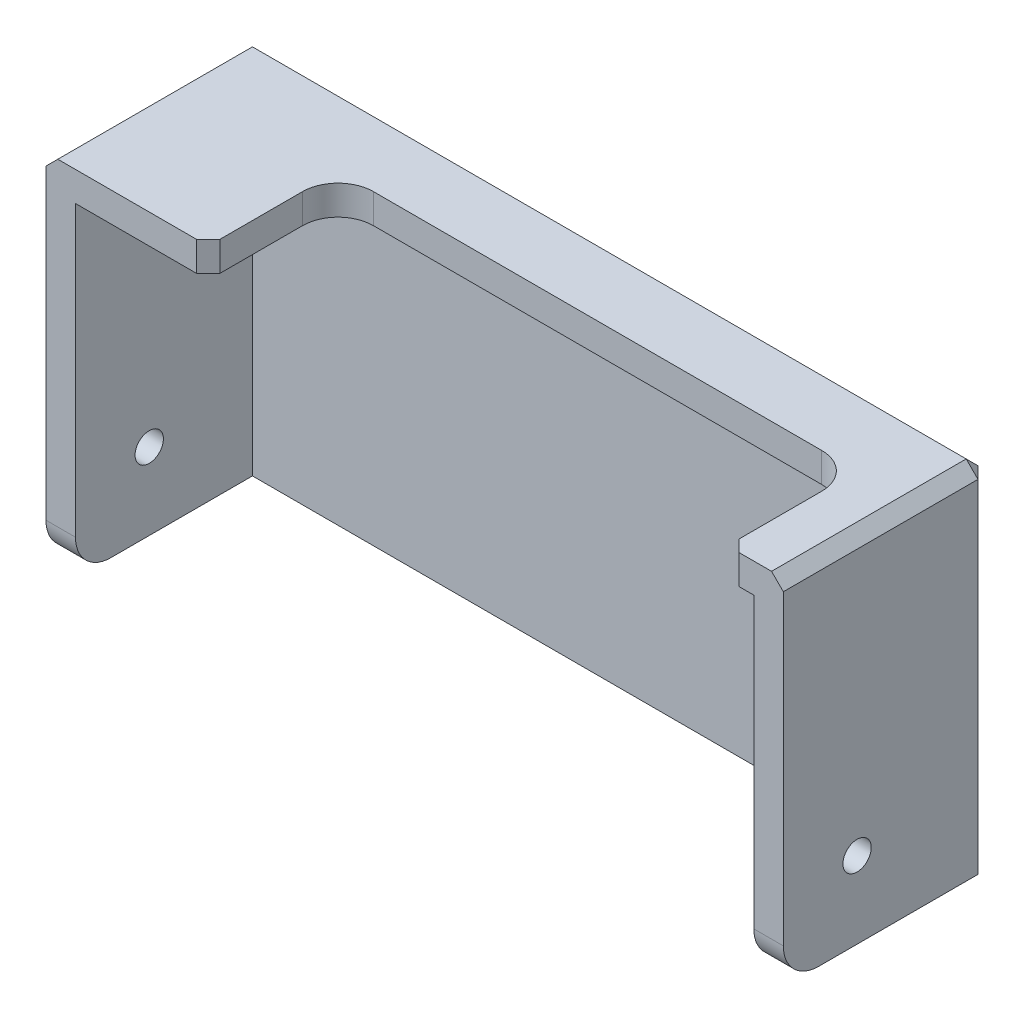
ISO-10303-21;
HEADER;
FILE_DESCRIPTION(('STEP AP214'),'2;1');
FILE_NAME('part.step','',(''),(''),'','','');
FILE_SCHEMA(('AUTOMOTIVE_DESIGN { 1 0 10303 214 1 1 1 1 }'));
ENDSEC;
DATA;
#1=APPLICATION_CONTEXT('core data for automotive mechanical design processes');
#2=APPLICATION_PROTOCOL_DEFINITION('international standard','automotive_design',2000,#1);
#3=PRODUCT_CONTEXT('',#1,'mechanical');
#4=PRODUCT('Part','Part','',(#3));
#5=PRODUCT_RELATED_PRODUCT_CATEGORY('part','',(#4));
#6=PRODUCT_DEFINITION_FORMATION('','',#4);
#7=PRODUCT_DEFINITION_CONTEXT('part definition',#1,'design');
#8=PRODUCT_DEFINITION('design','',#6,#7);
#9=PRODUCT_DEFINITION_SHAPE('','',#8);
#10=(LENGTH_UNIT() NAMED_UNIT(*) SI_UNIT(.MILLI.,.METRE.));
#11=(NAMED_UNIT(*) PLANE_ANGLE_UNIT() SI_UNIT($,.RADIAN.));
#12=(NAMED_UNIT(*) SI_UNIT($,.STERADIAN.) SOLID_ANGLE_UNIT());
#13=UNCERTAINTY_MEASURE_WITH_UNIT(LENGTH_MEASURE(1.E-05),#10,'distance_accuracy_value','');
#14=(GEOMETRIC_REPRESENTATION_CONTEXT(3) GLOBAL_UNCERTAINTY_ASSIGNED_CONTEXT((#13)) GLOBAL_UNIT_ASSIGNED_CONTEXT((#10,
#11,#12)) REPRESENTATION_CONTEXT('',''));
#15=CARTESIAN_POINT('',(0.,0.,0.));
#16=DIRECTION('',(0.,0.,1.));
#17=DIRECTION('',(1.,0.,0.));
#18=AXIS2_PLACEMENT_3D('',#15,#16,#17);
#19=CARTESIAN_POINT('',(0.,0.,30.));
#20=DIRECTION('',(0.,0.,-1.));
#21=DIRECTION('',(-1.,0.,0.));
#22=AXIS2_PLACEMENT_3D('',#19,#20,#21);
#23=PLANE('',#22);
#24=DIRECTION('',(0.,-1.,0.));
#25=VECTOR('',#24,1.);
#26=CARTESIAN_POINT('',(-62.5,0.,30.));
#27=LINE('',#26,#25);
#28=CARTESIAN_POINT('',(-62.5,30.5,30.));
#29=VERTEX_POINT('',#28);
#30=CARTESIAN_POINT('',(-62.5,-21.5,30.));
#31=VERTEX_POINT('',#30);
#32=EDGE_CURVE('E246',#29,#31,#27,.T.);
#33=ORIENTED_EDGE('',*,*,#32,.T.);
#34=DIRECTION('',(1.,0.,0.));
#35=VECTOR('',#34,1.);
#36=CARTESIAN_POINT('',(0.,-21.5,30.));
#37=LINE('',#36,#35);
#38=CARTESIAN_POINT('',(-57.5,-21.5,30.));
#39=VERTEX_POINT('',#38);
#40=EDGE_CURVE('E367',#31,#39,#37,.T.);
#41=ORIENTED_EDGE('',*,*,#40,.T.);
#42=DIRECTION('',(0.,-1.,0.));
#43=VECTOR('',#42,1.);
#44=CARTESIAN_POINT('',(-57.5,-27.5,30.));
#45=LINE('',#44,#43);
#46=CARTESIAN_POINT('',(-57.5,27.5,30.));
#47=VERTEX_POINT('',#46);
#48=EDGE_CURVE('E220',#47,#39,#45,.T.);
#49=ORIENTED_EDGE('',*,*,#48,.F.);
#50=DIRECTION('',(-1.,0.,0.));
#51=VECTOR('',#50,1.);
#52=CARTESIAN_POINT('',(-57.5,27.5,30.));
#53=LINE('',#52,#51);
#54=CARTESIAN_POINT('',(-37.,27.5,30.));
#55=VERTEX_POINT('',#54);
#56=EDGE_CURVE('E203',#55,#47,#53,.T.);
#57=ORIENTED_EDGE('',*,*,#56,.F.);
#58=DIRECTION('',(0.,1.,0.));
#59=VECTOR('',#58,1.);
#60=CARTESIAN_POINT('',(-37.,0.,30.));
#61=LINE('',#60,#59);
#62=CARTESIAN_POINT('',(-37.,32.5,30.));
#63=VERTEX_POINT('',#62);
#64=EDGE_CURVE('E289',#55,#63,#61,.T.);
#65=ORIENTED_EDGE('',*,*,#64,.T.);
#66=DIRECTION('',(-1.,0.,0.));
#67=VECTOR('',#66,1.);
#68=CARTESIAN_POINT('',(0.,32.5,30.));
#69=LINE('',#68,#67);
#70=CARTESIAN_POINT('',(-60.5,32.5,30.));
#71=VERTEX_POINT('',#70);
#72=EDGE_CURVE('E242',#63,#71,#69,.T.);
#73=ORIENTED_EDGE('',*,*,#72,.T.);
#74=DIRECTION('',(0.70710678118655,0.707106781186545,0.));
#75=VECTOR('',#74,1.);
#76=CARTESIAN_POINT('',(-62.5,30.5,30.));
#77=LINE('',#76,#75);
#78=EDGE_CURVE('E287',#71,#29,#77,.F.);
#79=ORIENTED_EDGE('',*,*,#78,.T.);
#80=EDGE_LOOP('',(#33,#41,#49,#57,#65,#73,#79));
#81=FACE_BOUND('',#80,.T.);
#82=ADVANCED_FACE('F41',(#81),#23,.F.);
#83=CARTESIAN_POINT('',(-57.5,-27.5,30.));
#84=DIRECTION('',(0.,1.,0.));
#85=DIRECTION('',(0.,0.,1.));
#86=AXIS2_PLACEMENT_3D('',#83,#84,#85);
#87=PLANE('',#86);
#88=DIRECTION('',(0.,0.,-1.));
#89=VECTOR('',#88,1.);
#90=CARTESIAN_POINT('',(62.5,-27.5,30.));
#91=LINE('',#90,#89);
#92=CARTESIAN_POINT('',(62.5,-27.5,24.));
#93=VERTEX_POINT('',#92);
#94=CARTESIAN_POINT('',(62.5,-27.5,-3.00000000000001));
#95=VERTEX_POINT('',#94);
#96=EDGE_CURVE('E256',#93,#95,#91,.T.);
#97=ORIENTED_EDGE('',*,*,#96,.F.);
#98=DIRECTION('',(1.,0.,0.));
#99=VECTOR('',#98,1.);
#100=CARTESIAN_POINT('',(-57.5,-27.5,24.));
#101=LINE('',#100,#99);
#102=CARTESIAN_POINT('',(57.5,-27.5,24.));
#103=VERTEX_POINT('',#102);
#104=EDGE_CURVE('E364',#93,#103,#101,.F.);
#105=ORIENTED_EDGE('',*,*,#104,.T.);
#106=DIRECTION('',(0.,0.,-1.));
#107=VECTOR('',#106,1.);
#108=CARTESIAN_POINT('',(57.5,-27.5,30.));
#109=LINE('',#108,#107);
#110=CARTESIAN_POINT('',(57.5,-27.5,0.));
#111=VERTEX_POINT('',#110);
#112=EDGE_CURVE('E223',#103,#111,#109,.T.);
#113=ORIENTED_EDGE('',*,*,#112,.T.);
#114=DIRECTION('',(1.,0.,0.));
#115=VECTOR('',#114,1.);
#116=CARTESIAN_POINT('',(-57.5,-27.5,0.));
#117=LINE('',#116,#115);
#118=CARTESIAN_POINT('',(-57.5,-27.5,0.));
#119=VERTEX_POINT('',#118);
#120=EDGE_CURVE('E204',#119,#111,#117,.T.);
#121=ORIENTED_EDGE('',*,*,#120,.F.);
#122=DIRECTION('',(0.,0.,-1.));
#123=VECTOR('',#122,1.);
#124=CARTESIAN_POINT('',(-57.5,-27.5,30.));
#125=LINE('',#124,#123);
#126=CARTESIAN_POINT('',(-57.5,-27.5,24.));
#127=VERTEX_POINT('',#126);
#128=EDGE_CURVE('E237',#127,#119,#125,.T.);
#129=ORIENTED_EDGE('',*,*,#128,.F.);
#130=DIRECTION('',(1.,0.,0.));
#131=VECTOR('',#130,1.);
#132=CARTESIAN_POINT('',(-57.5,-27.5,24.));
#133=LINE('',#132,#131);
#134=CARTESIAN_POINT('',(-62.5,-27.5,24.));
#135=VERTEX_POINT('',#134);
#136=EDGE_CURVE('E362',#127,#135,#133,.F.);
#137=ORIENTED_EDGE('',*,*,#136,.T.);
#138=DIRECTION('',(0.,0.,-1.));
#139=VECTOR('',#138,1.);
#140=CARTESIAN_POINT('',(-62.5,-27.5,30.));
#141=LINE('',#140,#139);
#142=CARTESIAN_POINT('',(-62.5,-27.5,-3.00000000000001));
#143=VERTEX_POINT('',#142);
#144=EDGE_CURVE('E257',#135,#143,#141,.T.);
#145=ORIENTED_EDGE('',*,*,#144,.T.);
#146=DIRECTION('',(1.,0.,0.));
#147=VECTOR('',#146,1.);
#148=CARTESIAN_POINT('',(62.5,-27.5,-3.00000000000001));
#149=LINE('',#148,#147);
#150=EDGE_CURVE('E309',#143,#95,#149,.T.);
#151=ORIENTED_EDGE('',*,*,#150,.T.);
#152=EDGE_LOOP('',(#97,#105,#113,#121,#129,#137,#145,#151));
#153=FACE_BOUND('',#152,.T.);
#154=ADVANCED_FACE('F377',(#153),#87,.F.);
#155=DIRECTION('',(0.,1.,0.));
#156=VECTOR('',#155,1.);
#157=CARTESIAN_POINT('',(57.5,-27.5,30.));
#158=LINE('',#157,#156);
#159=CARTESIAN_POINT('',(57.5,-21.5,30.));
#160=VERTEX_POINT('',#159);
#161=CARTESIAN_POINT('',(57.5,27.5,30.));
#162=VERTEX_POINT('',#161);
#163=EDGE_CURVE('E190',#160,#162,#158,.T.);
#164=ORIENTED_EDGE('',*,*,#163,.F.);
#165=DIRECTION('',(1.,0.,0.));
#166=VECTOR('',#165,1.);
#167=CARTESIAN_POINT('',(0.,-21.5,30.));
#168=LINE('',#167,#166);
#169=CARTESIAN_POINT('',(62.5,-21.5,30.));
#170=VERTEX_POINT('',#169);
#171=EDGE_CURVE('E358',#160,#170,#168,.T.);
#172=ORIENTED_EDGE('',*,*,#171,.T.);
#173=DIRECTION('',(0.,1.,0.));
#174=VECTOR('',#173,1.);
#175=CARTESIAN_POINT('',(62.5,0.,30.));
#176=LINE('',#175,#174);
#177=CARTESIAN_POINT('',(62.5,30.5,30.));
#178=VERTEX_POINT('',#177);
#179=EDGE_CURVE('E240',#170,#178,#176,.T.);
#180=ORIENTED_EDGE('',*,*,#179,.T.);
#181=DIRECTION('',(0.707106781186551,-0.707106781186544,0.));
#182=VECTOR('',#181,1.);
#183=CARTESIAN_POINT('',(60.5,32.5,30.));
#184=LINE('',#183,#182);
#185=CARTESIAN_POINT('',(60.5,32.5,30.));
#186=VERTEX_POINT('',#185);
#187=EDGE_CURVE('E280',#178,#186,#184,.F.);
#188=ORIENTED_EDGE('',*,*,#187,.T.);
#189=DIRECTION('',(-1.,0.,0.));
#190=VECTOR('',#189,1.);
#191=CARTESIAN_POINT('',(0.,32.5,30.));
#192=LINE('',#191,#190);
#193=CARTESIAN_POINT('',(55.,32.5,30.));
#194=VERTEX_POINT('',#193);
#195=EDGE_CURVE('E244',#186,#194,#192,.T.);
#196=ORIENTED_EDGE('',*,*,#195,.T.);
#197=DIRECTION('',(0.,-1.,0.));
#198=VECTOR('',#197,1.);
#199=CARTESIAN_POINT('',(55.,0.,30.));
#200=LINE('',#199,#198);
#201=CARTESIAN_POINT('',(55.,27.5,30.));
#202=VERTEX_POINT('',#201);
#203=EDGE_CURVE('E219',#194,#202,#200,.T.);
#204=ORIENTED_EDGE('',*,*,#203,.T.);
#205=EDGE_CURVE('E209',#162,#202,#53,.T.);
#206=ORIENTED_EDGE('',*,*,#205,.F.);
#207=EDGE_LOOP('',(#164,#172,#180,#188,#196,#204,#206));
#208=FACE_BOUND('',#207,.T.);
#209=ADVANCED_FACE('F216',(#208),#23,.F.);
#210=CARTESIAN_POINT('',(-35.,-27.5,30.));
#211=DIRECTION('',(-1.,0.,0.));
#212=DIRECTION('',(0.,0.,1.));
#213=AXIS2_PLACEMENT_3D('',#210,#211,#212);
#214=PLANE('',#213);
#215=DIRECTION('',(0.,0.,1.));
#216=VECTOR('',#215,1.);
#217=CARTESIAN_POINT('',(-35.,27.5,30.));
#218=LINE('',#217,#216);
#219=CARTESIAN_POINT('',(-35.,27.5,14.));
#220=VERTEX_POINT('',#219);
#221=CARTESIAN_POINT('',(-35.,27.5,28.));
#222=VERTEX_POINT('',#221);
#223=EDGE_CURVE('E437',#220,#222,#218,.T.);
#224=ORIENTED_EDGE('',*,*,#223,.F.);
#225=DIRECTION('',(0.,1.,0.));
#226=VECTOR('',#225,1.);
#227=CARTESIAN_POINT('',(-35.,32.5,14.));
#228=LINE('',#227,#226);
#229=CARTESIAN_POINT('',(-35.,32.5,14.));
#230=VERTEX_POINT('',#229);
#231=EDGE_CURVE('E317',#220,#230,#228,.T.);
#232=ORIENTED_EDGE('',*,*,#231,.T.);
#233=DIRECTION('',(0.,0.,1.));
#234=VECTOR('',#233,1.);
#235=CARTESIAN_POINT('',(-35.,32.5,30.));
#236=LINE('',#235,#234);
#237=CARTESIAN_POINT('',(-35.,32.5,28.));
#238=VERTEX_POINT('',#237);
#239=EDGE_CURVE('E213',#230,#238,#236,.T.);
#240=ORIENTED_EDGE('',*,*,#239,.T.);
#241=DIRECTION('',(0.,-1.,0.));
#242=VECTOR('',#241,1.);
#243=CARTESIAN_POINT('',(-35.,-27.5,28.));
#244=LINE('',#243,#242);
#245=EDGE_CURVE('E292',#238,#222,#244,.T.);
#246=ORIENTED_EDGE('',*,*,#245,.T.);
#247=EDGE_LOOP('',(#224,#232,#240,#246));
#248=FACE_BOUND('',#247,.T.);
#249=ADVANCED_FACE('F470',(#248),#214,.F.);
#250=CARTESIAN_POINT('',(-35.,-27.5,8.));
#251=DIRECTION('',(0.,0.,-1.));
#252=DIRECTION('',(-1.,0.,0.));
#253=AXIS2_PLACEMENT_3D('',#250,#251,#252);
#254=PLANE('',#253);
#255=DIRECTION('',(-1.,0.,0.));
#256=VECTOR('',#255,1.);
#257=CARTESIAN_POINT('',(-35.,32.5,8.));
#258=LINE('',#257,#256);
#259=CARTESIAN_POINT('',(47.,32.5,8.));
#260=VERTEX_POINT('',#259);
#261=CARTESIAN_POINT('',(-29.,32.5,8.));
#262=VERTEX_POINT('',#261);
#263=EDGE_CURVE('E243',#260,#262,#258,.T.);
#264=ORIENTED_EDGE('',*,*,#263,.T.);
#265=DIRECTION('',(0.,1.,0.));
#266=VECTOR('',#265,1.);
#267=CARTESIAN_POINT('',(-29.,27.5,8.));
#268=LINE('',#267,#266);
#269=CARTESIAN_POINT('',(-29.,27.5,8.));
#270=VERTEX_POINT('',#269);
#271=EDGE_CURVE('E346',#262,#270,#268,.F.);
#272=ORIENTED_EDGE('',*,*,#271,.T.);
#273=DIRECTION('',(-1.,0.,0.));
#274=VECTOR('',#273,1.);
#275=CARTESIAN_POINT('',(-35.,27.5,8.));
#276=LINE('',#275,#274);
#277=CARTESIAN_POINT('',(47.,27.5,8.));
#278=VERTEX_POINT('',#277);
#279=EDGE_CURVE('E229',#278,#270,#276,.T.);
#280=ORIENTED_EDGE('',*,*,#279,.F.);
#281=DIRECTION('',(0.,1.,0.));
#282=VECTOR('',#281,1.);
#283=CARTESIAN_POINT('',(47.,32.5,8.));
#284=LINE('',#283,#282);
#285=EDGE_CURVE('E343',#278,#260,#284,.T.);
#286=ORIENTED_EDGE('',*,*,#285,.T.);
#287=EDGE_LOOP('',(#264,#272,#280,#286));
#288=FACE_BOUND('',#287,.T.);
#289=ADVANCED_FACE('F474',(#288),#254,.F.);
#290=CARTESIAN_POINT('',(53.,-27.5,30.));
#291=DIRECTION('',(1.,0.,0.));
#292=DIRECTION('',(0.,0.,-1.));
#293=AXIS2_PLACEMENT_3D('',#290,#291,#292);
#294=PLANE('',#293);
#295=DIRECTION('',(0.,0.,-1.));
#296=VECTOR('',#295,1.);
#297=CARTESIAN_POINT('',(53.,32.5,30.));
#298=LINE('',#297,#296);
#299=CARTESIAN_POINT('',(53.,32.5,28.));
#300=VERTEX_POINT('',#299);
#301=CARTESIAN_POINT('',(53.,32.5,14.));
#302=VERTEX_POINT('',#301);
#303=EDGE_CURVE('E247',#300,#302,#298,.T.);
#304=ORIENTED_EDGE('',*,*,#303,.T.);
#305=DIRECTION('',(0.,1.,0.));
#306=VECTOR('',#305,1.);
#307=CARTESIAN_POINT('',(53.,27.5,14.));
#308=LINE('',#307,#306);
#309=CARTESIAN_POINT('',(53.,27.5,14.));
#310=VERTEX_POINT('',#309);
#311=EDGE_CURVE('E348',#302,#310,#308,.F.);
#312=ORIENTED_EDGE('',*,*,#311,.T.);
#313=DIRECTION('',(0.,0.,-1.));
#314=VECTOR('',#313,1.);
#315=CARTESIAN_POINT('',(53.,27.5,30.));
#316=LINE('',#315,#314);
#317=CARTESIAN_POINT('',(53.,27.5,28.));
#318=VERTEX_POINT('',#317);
#319=EDGE_CURVE('E435',#318,#310,#316,.T.);
#320=ORIENTED_EDGE('',*,*,#319,.F.);
#321=DIRECTION('',(0.,1.,0.));
#322=VECTOR('',#321,1.);
#323=CARTESIAN_POINT('',(53.,-27.5,28.));
#324=LINE('',#323,#322);
#325=EDGE_CURVE('E259',#318,#300,#324,.T.);
#326=ORIENTED_EDGE('',*,*,#325,.T.);
#327=EDGE_LOOP('',(#304,#312,#320,#326));
#328=FACE_BOUND('',#327,.T.);
#329=ADVANCED_FACE('F432',(#328),#294,.F.);
#330=CARTESIAN_POINT('',(62.5,-27.5,30.));
#331=DIRECTION('',(-1.,0.,0.));
#332=DIRECTION('',(0.,0.,1.));
#333=AXIS2_PLACEMENT_3D('',#330,#331,#332);
#334=PLANE('',#333);
#335=CARTESIAN_POINT('',(62.5,-14.5,17.5));
#336=DIRECTION('',(-1.,0.,0.));
#337=DIRECTION('',(0.,0.,1.));
#338=AXIS2_PLACEMENT_3D('',#335,#336,#337);
#339=CIRCLE('',#338,2.39999999999998);
#340=CARTESIAN_POINT('',(62.5,-14.5,19.9));
#341=VERTEX_POINT('',#340);
#342=EDGE_CURVE('E265',#341,#341,#339,.T.);
#343=ORIENTED_EDGE('',*,*,#342,.T.);
#344=EDGE_LOOP('',(#343));
#345=FACE_BOUND('',#344,.T.);
#346=ORIENTED_EDGE('',*,*,#179,.F.);
#347=CARTESIAN_POINT('',(62.5,-21.5,24.));
#348=DIRECTION('',(-1.,0.,0.));
#349=DIRECTION('',(0.,0.,1.));
#350=AXIS2_PLACEMENT_3D('',#347,#348,#349);
#351=CIRCLE('',#350,6.);
#352=EDGE_CURVE('E360',#170,#93,#351,.F.);
#353=ORIENTED_EDGE('',*,*,#352,.T.);
#354=ORIENTED_EDGE('',*,*,#96,.T.);
#355=DIRECTION('',(0.,1.,0.));
#356=VECTOR('',#355,1.);
#357=CARTESIAN_POINT('',(62.5,32.5,-3.00000000000001));
#358=LINE('',#357,#356);
#359=CARTESIAN_POINT('',(62.5,30.5,-3.00000000000001));
#360=VERTEX_POINT('',#359);
#361=EDGE_CURVE('E304',#95,#360,#358,.T.);
#362=ORIENTED_EDGE('',*,*,#361,.T.);
#363=DIRECTION('',(0.,0.,1.));
#364=VECTOR('',#363,1.);
#365=CARTESIAN_POINT('',(62.5,30.5,30.));
#366=LINE('',#365,#364);
#367=EDGE_CURVE('E306',#360,#178,#366,.T.);
#368=ORIENTED_EDGE('',*,*,#367,.T.);
#369=EDGE_LOOP('',(#346,#353,#354,#362,#368));
#370=FACE_BOUND('',#369,.T.);
#371=ADVANCED_FACE('F415',(#345,#370),#334,.F.);
#372=CARTESIAN_POINT('',(-57.5,32.5,30.));
#373=DIRECTION('',(0.,-1.,0.));
#374=DIRECTION('',(0.,0.,-1.));
#375=AXIS2_PLACEMENT_3D('',#372,#373,#374);
#376=PLANE('',#375);
#377=ORIENTED_EDGE('',*,*,#303,.F.);
#378=DIRECTION('',(-0.707106781186548,0.,-0.707106781186548));
#379=VECTOR('',#378,1.);
#380=CARTESIAN_POINT('',(53.,32.5,28.));
#381=LINE('',#380,#379);
#382=EDGE_CURVE('E278',#300,#194,#381,.F.);
#383=ORIENTED_EDGE('',*,*,#382,.T.);
#384=ORIENTED_EDGE('',*,*,#195,.F.);
#385=DIRECTION('',(0.,0.,-1.));
#386=VECTOR('',#385,1.);
#387=CARTESIAN_POINT('',(60.5,32.5,30.));
#388=LINE('',#387,#386);
#389=CARTESIAN_POINT('',(60.5,32.5,-3.));
#390=VERTEX_POINT('',#389);
#391=EDGE_CURVE('E273',#186,#390,#388,.T.);
#392=ORIENTED_EDGE('',*,*,#391,.T.);
#393=DIRECTION('',(-1.,0.,0.));
#394=VECTOR('',#393,1.);
#395=CARTESIAN_POINT('',(-62.5,32.5,-3.));
#396=LINE('',#395,#394);
#397=CARTESIAN_POINT('',(-60.5,32.5,-3.));
#398=VERTEX_POINT('',#397);
#399=EDGE_CURVE('E270',#390,#398,#396,.T.);
#400=ORIENTED_EDGE('',*,*,#399,.T.);
#401=DIRECTION('',(0.,0.,1.));
#402=VECTOR('',#401,1.);
#403=CARTESIAN_POINT('',(-60.5,32.5,30.));
#404=LINE('',#403,#402);
#405=EDGE_CURVE('E268',#398,#71,#404,.T.);
#406=ORIENTED_EDGE('',*,*,#405,.T.);
#407=ORIENTED_EDGE('',*,*,#72,.F.);
#408=DIRECTION('',(-0.707106781186545,0.,0.70710678118655));
#409=VECTOR('',#408,1.);
#410=CARTESIAN_POINT('',(-37.,32.5,30.));
#411=LINE('',#410,#409);
#412=EDGE_CURVE('E275',#63,#238,#411,.F.);
#413=ORIENTED_EDGE('',*,*,#412,.T.);
#414=ORIENTED_EDGE('',*,*,#239,.F.);
#415=CARTESIAN_POINT('',(-29.,32.5,14.));
#416=DIRECTION('',(0.,-1.,0.));
#417=DIRECTION('',(0.,0.,-1.));
#418=AXIS2_PLACEMENT_3D('',#415,#416,#417);
#419=CIRCLE('',#418,6.);
#420=EDGE_CURVE('E350',#230,#262,#419,.T.);
#421=ORIENTED_EDGE('',*,*,#420,.T.);
#422=ORIENTED_EDGE('',*,*,#263,.F.);
#423=CARTESIAN_POINT('',(47.,32.5,14.));
#424=DIRECTION('',(0.,-1.,0.));
#425=DIRECTION('',(0.,0.,-1.));
#426=AXIS2_PLACEMENT_3D('',#423,#424,#425);
#427=CIRCLE('',#426,6.);
#428=EDGE_CURVE('E354',#260,#302,#427,.T.);
#429=ORIENTED_EDGE('',*,*,#428,.T.);
#430=EDGE_LOOP('',(#377,#383,#384,#392,#400,#406,#407,#413,#414,#421,#422,#429));
#431=FACE_BOUND('',#430,.T.);
#432=ADVANCED_FACE('F426',(#431),#376,.F.);
#433=CARTESIAN_POINT('',(-62.5,-27.5,30.));
#434=DIRECTION('',(1.,0.,0.));
#435=DIRECTION('',(0.,0.,-1.));
#436=AXIS2_PLACEMENT_3D('',#433,#434,#435);
#437=PLANE('',#436);
#438=CARTESIAN_POINT('',(-62.5,-14.5,17.5));
#439=DIRECTION('',(-1.,0.,0.));
#440=DIRECTION('',(0.,0.,1.));
#441=AXIS2_PLACEMENT_3D('',#438,#439,#440);
#442=CIRCLE('',#441,2.4);
#443=CARTESIAN_POINT('',(-62.5,-14.5,19.9));
#444=VERTEX_POINT('',#443);
#445=EDGE_CURVE('E340',#444,#444,#442,.T.);
#446=ORIENTED_EDGE('',*,*,#445,.F.);
#447=EDGE_LOOP('',(#446));
#448=FACE_BOUND('',#447,.T.);
#449=ORIENTED_EDGE('',*,*,#144,.F.);
#450=CARTESIAN_POINT('',(-62.5,-21.5,24.));
#451=DIRECTION('',(1.,0.,0.));
#452=DIRECTION('',(0.,0.,-1.));
#453=AXIS2_PLACEMENT_3D('',#450,#451,#452);
#454=CIRCLE('',#453,6.);
#455=EDGE_CURVE('E11',#135,#31,#454,.F.);
#456=ORIENTED_EDGE('',*,*,#455,.T.);
#457=ORIENTED_EDGE('',*,*,#32,.F.);
#458=DIRECTION('',(0.,0.,-1.));
#459=VECTOR('',#458,1.);
#460=CARTESIAN_POINT('',(-62.5,30.5,30.));
#461=LINE('',#460,#459);
#462=CARTESIAN_POINT('',(-62.5,30.5,-3.00000000000001));
#463=VERTEX_POINT('',#462);
#464=EDGE_CURVE('E312',#29,#463,#461,.T.);
#465=ORIENTED_EDGE('',*,*,#464,.T.);
#466=DIRECTION('',(0.,-1.,0.));
#467=VECTOR('',#466,1.);
#468=CARTESIAN_POINT('',(-62.5,-27.5,-3.00000000000001));
#469=LINE('',#468,#467);
#470=EDGE_CURVE('E314',#463,#143,#469,.T.);
#471=ORIENTED_EDGE('',*,*,#470,.T.);
#472=EDGE_LOOP('',(#449,#456,#457,#465,#471));
#473=FACE_BOUND('',#472,.T.);
#474=ADVANCED_FACE('F382',(#448,#473),#437,.F.);
#475=CARTESIAN_POINT('',(0.,0.,-5.));
#476=DIRECTION('',(0.,0.,-1.));
#477=DIRECTION('',(-1.,0.,0.));
#478=AXIS2_PLACEMENT_3D('',#475,#476,#477);
#479=PLANE('',#478);
#480=DIRECTION('',(0.,1.,0.));
#481=VECTOR('',#480,1.);
#482=CARTESIAN_POINT('',(-60.5,32.5,-5.));
#483=LINE('',#482,#481);
#484=CARTESIAN_POINT('',(-60.5,-25.5,-5.));
#485=VERTEX_POINT('',#484);
#486=CARTESIAN_POINT('',(-60.5,30.5,-5.));
#487=VERTEX_POINT('',#486);
#488=EDGE_CURVE('E295',#485,#487,#483,.T.);
#489=ORIENTED_EDGE('',*,*,#488,.T.);
#490=DIRECTION('',(1.,0.,0.));
#491=VECTOR('',#490,1.);
#492=CARTESIAN_POINT('',(62.5,30.5,-5.));
#493=LINE('',#492,#491);
#494=CARTESIAN_POINT('',(60.5,30.5,-5.));
#495=VERTEX_POINT('',#494);
#496=EDGE_CURVE('E301',#487,#495,#493,.T.);
#497=ORIENTED_EDGE('',*,*,#496,.T.);
#498=DIRECTION('',(0.,-1.,0.));
#499=VECTOR('',#498,1.);
#500=CARTESIAN_POINT('',(60.5,-27.5,-5.));
#501=LINE('',#500,#499);
#502=CARTESIAN_POINT('',(60.5,-25.5,-5.));
#503=VERTEX_POINT('',#502);
#504=EDGE_CURVE('E299',#495,#503,#501,.T.);
#505=ORIENTED_EDGE('',*,*,#504,.T.);
#506=DIRECTION('',(-1.,0.,0.));
#507=VECTOR('',#506,1.);
#508=CARTESIAN_POINT('',(-62.5,-25.5,-5.));
#509=LINE('',#508,#507);
#510=EDGE_CURVE('E297',#503,#485,#509,.T.);
#511=ORIENTED_EDGE('',*,*,#510,.T.);
#512=EDGE_LOOP('',(#489,#497,#505,#511));
#513=FACE_BOUND('',#512,.T.);
#514=ADVANCED_FACE('F401',(#513),#479,.T.);
#515=CARTESIAN_POINT('',(57.5,-27.5,30.));
#516=DIRECTION('',(-1.,0.,0.));
#517=DIRECTION('',(0.,0.,1.));
#518=AXIS2_PLACEMENT_3D('',#515,#516,#517);
#519=PLANE('',#518);
#520=CARTESIAN_POINT('',(57.5,-14.5,17.5));
#521=DIRECTION('',(-1.,0.,0.));
#522=DIRECTION('',(0.,0.,1.));
#523=AXIS2_PLACEMENT_3D('',#520,#521,#522);
#524=CIRCLE('',#523,2.39999999999999);
#525=CARTESIAN_POINT('',(57.5,-14.5,19.9));
#526=VERTEX_POINT('',#525);
#527=EDGE_CURVE('E264',#526,#526,#524,.T.);
#528=ORIENTED_EDGE('',*,*,#527,.F.);
#529=EDGE_LOOP('',(#528));
#530=FACE_BOUND('',#529,.T.);
#531=ORIENTED_EDGE('',*,*,#112,.F.);
#532=CARTESIAN_POINT('',(57.5,-21.5,24.));
#533=DIRECTION('',(-1.,0.,0.));
#534=DIRECTION('',(0.,0.,1.));
#535=AXIS2_PLACEMENT_3D('',#532,#533,#534);
#536=CIRCLE('',#535,6.);
#537=EDGE_CURVE('E198',#103,#160,#536,.T.);
#538=ORIENTED_EDGE('',*,*,#537,.T.);
#539=ORIENTED_EDGE('',*,*,#163,.T.);
#540=DIRECTION('',(0.,0.,-1.));
#541=VECTOR('',#540,1.);
#542=CARTESIAN_POINT('',(57.5,27.5,30.));
#543=LINE('',#542,#541);
#544=CARTESIAN_POINT('',(57.5,27.5,0.));
#545=VERTEX_POINT('',#544);
#546=EDGE_CURVE('E195',#162,#545,#543,.T.);
#547=ORIENTED_EDGE('',*,*,#546,.T.);
#548=DIRECTION('',(0.,1.,0.));
#549=VECTOR('',#548,1.);
#550=CARTESIAN_POINT('',(57.5,-27.5,0.));
#551=LINE('',#550,#549);
#552=EDGE_CURVE('E227',#111,#545,#551,.T.);
#553=ORIENTED_EDGE('',*,*,#552,.F.);
#554=EDGE_LOOP('',(#531,#538,#539,#547,#553));
#555=FACE_BOUND('',#554,.T.);
#556=ADVANCED_FACE('F193',(#530,#555),#519,.T.);
#557=CARTESIAN_POINT('',(-57.5,27.5,30.));
#558=DIRECTION('',(0.,-1.,0.));
#559=DIRECTION('',(0.,0.,-1.));
#560=AXIS2_PLACEMENT_3D('',#557,#558,#559);
#561=PLANE('',#560);
#562=ORIENTED_EDGE('',*,*,#205,.T.);
#563=DIRECTION('',(0.707106781186548,0.,0.707106781186548));
#564=VECTOR('',#563,1.);
#565=CARTESIAN_POINT('',(-1.25,27.5,-26.25));
#566=LINE('',#565,#564);
#567=EDGE_CURVE('E285',#202,#318,#566,.F.);
#568=ORIENTED_EDGE('',*,*,#567,.T.);
#569=ORIENTED_EDGE('',*,*,#319,.T.);
#570=CARTESIAN_POINT('',(47.,27.5,14.));
#571=DIRECTION('',(0.,-1.,0.));
#572=DIRECTION('',(0.,0.,-1.));
#573=AXIS2_PLACEMENT_3D('',#570,#571,#572);
#574=CIRCLE('',#573,6.);
#575=EDGE_CURVE('E356',#310,#278,#574,.F.);
#576=ORIENTED_EDGE('',*,*,#575,.T.);
#577=ORIENTED_EDGE('',*,*,#279,.T.);
#578=CARTESIAN_POINT('',(-29.,27.5,14.));
#579=DIRECTION('',(0.,-1.,0.));
#580=DIRECTION('',(0.,0.,-1.));
#581=AXIS2_PLACEMENT_3D('',#578,#579,#580);
#582=CIRCLE('',#581,6.);
#583=EDGE_CURVE('E352',#270,#220,#582,.F.);
#584=ORIENTED_EDGE('',*,*,#583,.T.);
#585=ORIENTED_EDGE('',*,*,#223,.T.);
#586=DIRECTION('',(0.707106781186545,0.,-0.70710678118655));
#587=VECTOR('',#586,1.);
#588=CARTESIAN_POINT('',(-47.2499999999999,27.5,40.25));
#589=LINE('',#588,#587);
#590=EDGE_CURVE('E283',#222,#55,#589,.F.);
#591=ORIENTED_EDGE('',*,*,#590,.T.);
#592=ORIENTED_EDGE('',*,*,#56,.T.);
#593=DIRECTION('',(0.,0.,-1.));
#594=VECTOR('',#593,1.);
#595=CARTESIAN_POINT('',(-57.5,27.5,30.));
#596=LINE('',#595,#594);
#597=CARTESIAN_POINT('',(-57.5,27.5,0.));
#598=VERTEX_POINT('',#597);
#599=EDGE_CURVE('E214',#47,#598,#596,.T.);
#600=ORIENTED_EDGE('',*,*,#599,.T.);
#601=DIRECTION('',(-1.,0.,0.));
#602=VECTOR('',#601,1.);
#603=CARTESIAN_POINT('',(-57.5,27.5,0.));
#604=LINE('',#603,#602);
#605=EDGE_CURVE('E212',#545,#598,#604,.T.);
#606=ORIENTED_EDGE('',*,*,#605,.F.);
#607=ORIENTED_EDGE('',*,*,#546,.F.);
#608=EDGE_LOOP('',(#562,#568,#569,#576,#577,#584,#585,#591,#592,#600,#606,#607));
#609=FACE_BOUND('',#608,.T.);
#610=ADVANCED_FACE('F208',(#609),#561,.T.);
#611=CARTESIAN_POINT('',(-57.5,-27.5,30.));
#612=DIRECTION('',(1.,0.,0.));
#613=DIRECTION('',(0.,0.,-1.));
#614=AXIS2_PLACEMENT_3D('',#611,#612,#613);
#615=PLANE('',#614);
#616=CARTESIAN_POINT('',(-57.5,-14.5,17.5));
#617=DIRECTION('',(1.,0.,0.));
#618=DIRECTION('',(0.,0.,-1.));
#619=AXIS2_PLACEMENT_3D('',#616,#617,#618);
#620=CIRCLE('',#619,2.39999999999999);
#621=CARTESIAN_POINT('',(-57.5,-14.5,15.1));
#622=VERTEX_POINT('',#621);
#623=EDGE_CURVE('E261',#622,#622,#620,.T.);
#624=ORIENTED_EDGE('',*,*,#623,.F.);
#625=EDGE_LOOP('',(#624));
#626=FACE_BOUND('',#625,.T.);
#627=ORIENTED_EDGE('',*,*,#48,.T.);
#628=CARTESIAN_POINT('',(-57.5,-21.5,24.));
#629=DIRECTION('',(1.,0.,0.));
#630=DIRECTION('',(0.,0.,-1.));
#631=AXIS2_PLACEMENT_3D('',#628,#629,#630);
#632=CIRCLE('',#631,6.);
#633=EDGE_CURVE('E49',#39,#127,#632,.T.);
#634=ORIENTED_EDGE('',*,*,#633,.T.);
#635=ORIENTED_EDGE('',*,*,#128,.T.);
#636=DIRECTION('',(0.,-1.,0.));
#637=VECTOR('',#636,1.);
#638=CARTESIAN_POINT('',(-57.5,-27.5,0.));
#639=LINE('',#638,#637);
#640=EDGE_CURVE('E231',#598,#119,#639,.T.);
#641=ORIENTED_EDGE('',*,*,#640,.F.);
#642=ORIENTED_EDGE('',*,*,#599,.F.);
#643=EDGE_LOOP('',(#627,#634,#635,#641,#642));
#644=FACE_BOUND('',#643,.T.);
#645=ADVANCED_FACE('F370',(#626,#644),#615,.T.);
#646=CARTESIAN_POINT('',(0.,0.,0.));
#647=DIRECTION('',(0.,0.,-1.));
#648=DIRECTION('',(-1.,0.,0.));
#649=AXIS2_PLACEMENT_3D('',#646,#647,#648);
#650=PLANE('',#649);
#651=ORIENTED_EDGE('',*,*,#552,.T.);
#652=ORIENTED_EDGE('',*,*,#605,.T.);
#653=ORIENTED_EDGE('',*,*,#640,.T.);
#654=ORIENTED_EDGE('',*,*,#120,.T.);
#655=EDGE_LOOP('',(#651,#652,#653,#654));
#656=FACE_BOUND('',#655,.T.);
#657=ADVANCED_FACE('F492',(#656),#650,.F.);
#658=CARTESIAN_POINT('',(-62.5,-14.5,17.5));
#659=DIRECTION('',(-1.,0.,0.));
#660=DIRECTION('',(0.,0.,1.));
#661=AXIS2_PLACEMENT_3D('',#658,#659,#660);
#662=CYLINDRICAL_SURFACE('',#661,2.39999999999999);
#663=ORIENTED_EDGE('',*,*,#623,.T.);
#664=EDGE_LOOP('',(#663));
#665=FACE_BOUND('',#664,.T.);
#666=ORIENTED_EDGE('',*,*,#445,.T.);
#667=EDGE_LOOP('',(#666));
#668=FACE_BOUND('',#667,.T.);
#669=ADVANCED_FACE('F449',(#665,#668),#662,.F.);
#670=ORIENTED_EDGE('',*,*,#527,.T.);
#671=EDGE_LOOP('',(#670));
#672=FACE_BOUND('',#671,.T.);
#673=ORIENTED_EDGE('',*,*,#342,.F.);
#674=EDGE_LOOP('',(#673));
#675=FACE_BOUND('',#674,.T.);
#676=ADVANCED_FACE('F498',(#672,#675),#662,.F.);
#677=CARTESIAN_POINT('',(53.,-27.5,28.));
#678=DIRECTION('',(0.707106781186547,0.,-0.707106781186547));
#679=DIRECTION('',(0.,1.,0.));
#680=AXIS2_PLACEMENT_3D('',#677,#678,#679);
#681=PLANE('',#680);
#682=ORIENTED_EDGE('',*,*,#567,.F.);
#683=ORIENTED_EDGE('',*,*,#203,.F.);
#684=ORIENTED_EDGE('',*,*,#382,.F.);
#685=ORIENTED_EDGE('',*,*,#325,.F.);
#686=EDGE_LOOP('',(#682,#683,#684,#685));
#687=FACE_BOUND('',#686,.T.);
#688=ADVANCED_FACE('F429',(#687),#681,.F.);
#689=CARTESIAN_POINT('',(-37.,0.,30.));
#690=DIRECTION('',(-0.70710678118655,0.,-0.707106781186545));
#691=DIRECTION('',(0.,1.,0.));
#692=AXIS2_PLACEMENT_3D('',#689,#690,#691);
#693=PLANE('',#692);
#694=ORIENTED_EDGE('',*,*,#590,.F.);
#695=ORIENTED_EDGE('',*,*,#245,.F.);
#696=ORIENTED_EDGE('',*,*,#412,.F.);
#697=ORIENTED_EDGE('',*,*,#64,.F.);
#698=EDGE_LOOP('',(#694,#695,#696,#697));
#699=FACE_BOUND('',#698,.T.);
#700=ADVANCED_FACE('F508',(#699),#693,.F.);
#701=CARTESIAN_POINT('',(-57.5,-27.5,-3.00000000000001));
#702=DIRECTION('',(0.,-0.707106781186545,-0.707106781186549));
#703=DIRECTION('',(-1.,0.,0.));
#704=AXIS2_PLACEMENT_3D('',#701,#702,#703);
#705=PLANE('',#704);
#706=DIRECTION('',(-0.577350269189627,-0.577350269189627,0.577350269189624));
#707=VECTOR('',#706,1.);
#708=CARTESIAN_POINT('',(-62.5,-27.5,-3.00000000000001));
#709=LINE('',#708,#707);
#710=EDGE_CURVE('E334',#485,#143,#709,.T.);
#711=ORIENTED_EDGE('',*,*,#710,.F.);
#712=ORIENTED_EDGE('',*,*,#510,.F.);
#713=DIRECTION('',(0.577350269189627,-0.577350269189627,0.577350269189624));
#714=VECTOR('',#713,1.);
#715=CARTESIAN_POINT('',(22.4999999999998,12.5000000000002,-42.9999999999999));
#716=LINE('',#715,#714);
#717=EDGE_CURVE('E337',#95,#503,#716,.F.);
#718=ORIENTED_EDGE('',*,*,#717,.F.);
#719=ORIENTED_EDGE('',*,*,#150,.F.);
#720=EDGE_LOOP('',(#711,#712,#718,#719));
#721=FACE_BOUND('',#720,.T.);
#722=ADVANCED_FACE('F408',(#721),#705,.T.);
#723=CARTESIAN_POINT('',(62.5,-27.5,-3.00000000000001));
#724=DIRECTION('',(0.707106781186545,0.,-0.707106781186549));
#725=DIRECTION('',(0.,-1.,0.));
#726=AXIS2_PLACEMENT_3D('',#723,#724,#725);
#727=PLANE('',#726);
#728=ORIENTED_EDGE('',*,*,#717,.T.);
#729=ORIENTED_EDGE('',*,*,#504,.F.);
#730=DIRECTION('',(-0.707106781186549,0.,-0.707106781186545));
#731=VECTOR('',#730,1.);
#732=CARTESIAN_POINT('',(60.5,30.5,-5.));
#733=LINE('',#732,#731);
#734=EDGE_CURVE('E331',#360,#495,#733,.T.);
#735=ORIENTED_EDGE('',*,*,#734,.F.);
#736=ORIENTED_EDGE('',*,*,#361,.F.);
#737=EDGE_LOOP('',(#728,#729,#735,#736));
#738=FACE_BOUND('',#737,.T.);
#739=ADVANCED_FACE('F572',(#738),#727,.T.);
#740=CARTESIAN_POINT('',(60.5,32.5,30.));
#741=DIRECTION('',(-0.707106781186544,-0.707106781186551,0.));
#742=DIRECTION('',(0.,0.,-1.));
#743=AXIS2_PLACEMENT_3D('',#740,#741,#742);
#744=PLANE('',#743);
#745=ORIENTED_EDGE('',*,*,#187,.F.);
#746=ORIENTED_EDGE('',*,*,#367,.F.);
#747=DIRECTION('',(-0.707106781186551,0.707106781186544,0.));
#748=VECTOR('',#747,1.);
#749=CARTESIAN_POINT('',(61.5,31.5,-3.));
#750=LINE('',#749,#748);
#751=EDGE_CURVE('E328',#390,#360,#750,.F.);
#752=ORIENTED_EDGE('',*,*,#751,.F.);
#753=ORIENTED_EDGE('',*,*,#391,.F.);
#754=EDGE_LOOP('',(#745,#746,#752,#753));
#755=FACE_BOUND('',#754,.T.);
#756=ADVANCED_FACE('F422',(#755),#744,.F.);
#757=CARTESIAN_POINT('',(-62.5,30.5,30.));
#758=DIRECTION('',(0.707106781186545,-0.70710678118655,0.));
#759=DIRECTION('',(0.,0.,-1.));
#760=AXIS2_PLACEMENT_3D('',#757,#758,#759);
#761=PLANE('',#760);
#762=ORIENTED_EDGE('',*,*,#78,.F.);
#763=ORIENTED_EDGE('',*,*,#405,.F.);
#764=DIRECTION('',(-0.70710678118655,-0.707106781186545,0.));
#765=VECTOR('',#764,1.);
#766=CARTESIAN_POINT('',(-60.5,32.5,-3.));
#767=LINE('',#766,#765);
#768=EDGE_CURVE('E325',#463,#398,#767,.F.);
#769=ORIENTED_EDGE('',*,*,#768,.F.);
#770=ORIENTED_EDGE('',*,*,#464,.F.);
#771=EDGE_LOOP('',(#762,#763,#769,#770));
#772=FACE_BOUND('',#771,.T.);
#773=ADVANCED_FACE('F386',(#772),#761,.F.);
#774=CARTESIAN_POINT('',(-62.5,-27.5,-3.00000000000001));
#775=DIRECTION('',(-0.707106781186545,0.,-0.707106781186549));
#776=DIRECTION('',(0.,1.,0.));
#777=AXIS2_PLACEMENT_3D('',#774,#775,#776);
#778=PLANE('',#777);
#779=ORIENTED_EDGE('',*,*,#710,.T.);
#780=ORIENTED_EDGE('',*,*,#470,.F.);
#781=DIRECTION('',(-0.707106781186549,0.,0.707106781186545));
#782=VECTOR('',#781,1.);
#783=CARTESIAN_POINT('',(-61.5,30.5,-4.));
#784=LINE('',#783,#782);
#785=EDGE_CURVE('E322',#487,#463,#784,.T.);
#786=ORIENTED_EDGE('',*,*,#785,.F.);
#787=ORIENTED_EDGE('',*,*,#488,.F.);
#788=EDGE_LOOP('',(#779,#780,#786,#787));
#789=FACE_BOUND('',#788,.T.);
#790=ADVANCED_FACE('F395',(#789),#778,.T.);
#791=CARTESIAN_POINT('',(60.5,30.5,-5.));
#792=DIRECTION('',(0.577350269189621,0.577350269189631,-0.577350269189625));
#793=DIRECTION('',(0.,0.707106781186543,0.707106781186552));
#794=AXIS2_PLACEMENT_3D('',#791,#792,#793);
#795=PLANE('',#794);
#796=ORIENTED_EDGE('',*,*,#751,.T.);
#797=ORIENTED_EDGE('',*,*,#734,.T.);
#798=DIRECTION('',(0.,0.707106781186545,0.70710678118655));
#799=VECTOR('',#798,1.);
#800=CARTESIAN_POINT('',(60.5,30.5,-5.));
#801=LINE('',#800,#799);
#802=EDGE_CURVE('E320',#390,#495,#801,.F.);
#803=ORIENTED_EDGE('',*,*,#802,.F.);
#804=EDGE_LOOP('',(#796,#797,#803));
#805=FACE_BOUND('',#804,.T.);
#806=ADVANCED_FACE('F606',(#805),#795,.T.);
#807=CARTESIAN_POINT('',(-60.5,32.5,-3.));
#808=DIRECTION('',(-0.577350269189622,0.57735026918963,-0.577350269189625));
#809=DIRECTION('',(0.,0.707106781186545,0.70710678118655));
#810=AXIS2_PLACEMENT_3D('',#807,#808,#809);
#811=PLANE('',#810);
#812=ORIENTED_EDGE('',*,*,#785,.T.);
#813=ORIENTED_EDGE('',*,*,#768,.T.);
#814=DIRECTION('',(0.,-0.707106781186545,-0.70710678118655));
#815=VECTOR('',#814,1.);
#816=CARTESIAN_POINT('',(-60.5,32.5,-3.));
#817=LINE('',#816,#815);
#818=EDGE_CURVE('E318',#487,#398,#817,.F.);
#819=ORIENTED_EDGE('',*,*,#818,.F.);
#820=EDGE_LOOP('',(#812,#813,#819));
#821=FACE_BOUND('',#820,.T.);
#822=ADVANCED_FACE('F391',(#821),#811,.T.);
#823=CARTESIAN_POINT('',(-57.5,32.5,-3.));
#824=DIRECTION('',(0.,0.70710678118655,-0.707106781186545));
#825=DIRECTION('',(1.,0.,0.));
#826=AXIS2_PLACEMENT_3D('',#823,#824,#825);
#827=PLANE('',#826);
#828=ORIENTED_EDGE('',*,*,#802,.T.);
#829=ORIENTED_EDGE('',*,*,#496,.F.);
#830=ORIENTED_EDGE('',*,*,#818,.T.);
#831=ORIENTED_EDGE('',*,*,#399,.F.);
#832=EDGE_LOOP('',(#828,#829,#830,#831));
#833=FACE_BOUND('',#832,.T.);
#834=ADVANCED_FACE('F397',(#833),#827,.T.);
#835=CARTESIAN_POINT('',(-29.,-27.5,14.));
#836=DIRECTION('',(0.,-1.,0.));
#837=DIRECTION('',(0.,0.,-1.));
#838=AXIS2_PLACEMENT_3D('',#835,#836,#837);
#839=CYLINDRICAL_SURFACE('',#838,6.);
#840=ORIENTED_EDGE('',*,*,#583,.F.);
#841=ORIENTED_EDGE('',*,*,#271,.F.);
#842=ORIENTED_EDGE('',*,*,#420,.F.);
#843=ORIENTED_EDGE('',*,*,#231,.F.);
#844=EDGE_LOOP('',(#840,#841,#842,#843));
#845=FACE_BOUND('',#844,.T.);
#846=ADVANCED_FACE('F631',(#845),#839,.F.);
#847=CARTESIAN_POINT('',(47.,-27.5,14.));
#848=DIRECTION('',(0.,-1.,0.));
#849=DIRECTION('',(0.,0.,-1.));
#850=AXIS2_PLACEMENT_3D('',#847,#848,#849);
#851=CYLINDRICAL_SURFACE('',#850,6.);
#852=ORIENTED_EDGE('',*,*,#575,.F.);
#853=ORIENTED_EDGE('',*,*,#311,.F.);
#854=ORIENTED_EDGE('',*,*,#428,.F.);
#855=ORIENTED_EDGE('',*,*,#285,.F.);
#856=EDGE_LOOP('',(#852,#853,#854,#855));
#857=FACE_BOUND('',#856,.T.);
#858=ADVANCED_FACE('F640',(#857),#851,.F.);
#859=CARTESIAN_POINT('',(0.,-21.5,24.));
#860=DIRECTION('',(1.,0.,0.));
#861=DIRECTION('',(0.,0.,-1.));
#862=AXIS2_PLACEMENT_3D('',#859,#860,#861);
#863=CYLINDRICAL_SURFACE('',#862,6.);
#864=ORIENTED_EDGE('',*,*,#537,.F.);
#865=ORIENTED_EDGE('',*,*,#104,.F.);
#866=ORIENTED_EDGE('',*,*,#352,.F.);
#867=ORIENTED_EDGE('',*,*,#171,.F.);
#868=EDGE_LOOP('',(#864,#865,#866,#867));
#869=FACE_BOUND('',#868,.T.);
#870=ADVANCED_FACE('F413',(#869),#863,.T.);
#871=CARTESIAN_POINT('',(0.,-21.5,24.));
#872=DIRECTION('',(1.,0.,0.));
#873=DIRECTION('',(0.,0.,-1.));
#874=AXIS2_PLACEMENT_3D('',#871,#872,#873);
#875=CYLINDRICAL_SURFACE('',#874,6.);
#876=ORIENTED_EDGE('',*,*,#455,.F.);
#877=ORIENTED_EDGE('',*,*,#136,.F.);
#878=ORIENTED_EDGE('',*,*,#633,.F.);
#879=ORIENTED_EDGE('',*,*,#40,.F.);
#880=EDGE_LOOP('',(#876,#877,#878,#879));
#881=FACE_BOUND('',#880,.T.);
#882=ADVANCED_FACE('F43',(#881),#875,.T.);
#883=CLOSED_SHELL('',(#82,#154,#209,#249,#289,#329,#371,#432,#474,#514,#556,#610,#645,#657,#669,
#676,#688,#700,#722,#739,#756,#773,#790,#806,#822,#834,#846,#858,#870,#882));
#884=MANIFOLD_SOLID_BREP('B2',#883);
#885=ADVANCED_BREP_SHAPE_REPRESENTATION('',(#18,#884),#14);
#886=SHAPE_DEFINITION_REPRESENTATION(#9,#885);
ENDSEC;
END-ISO-10303-21;
